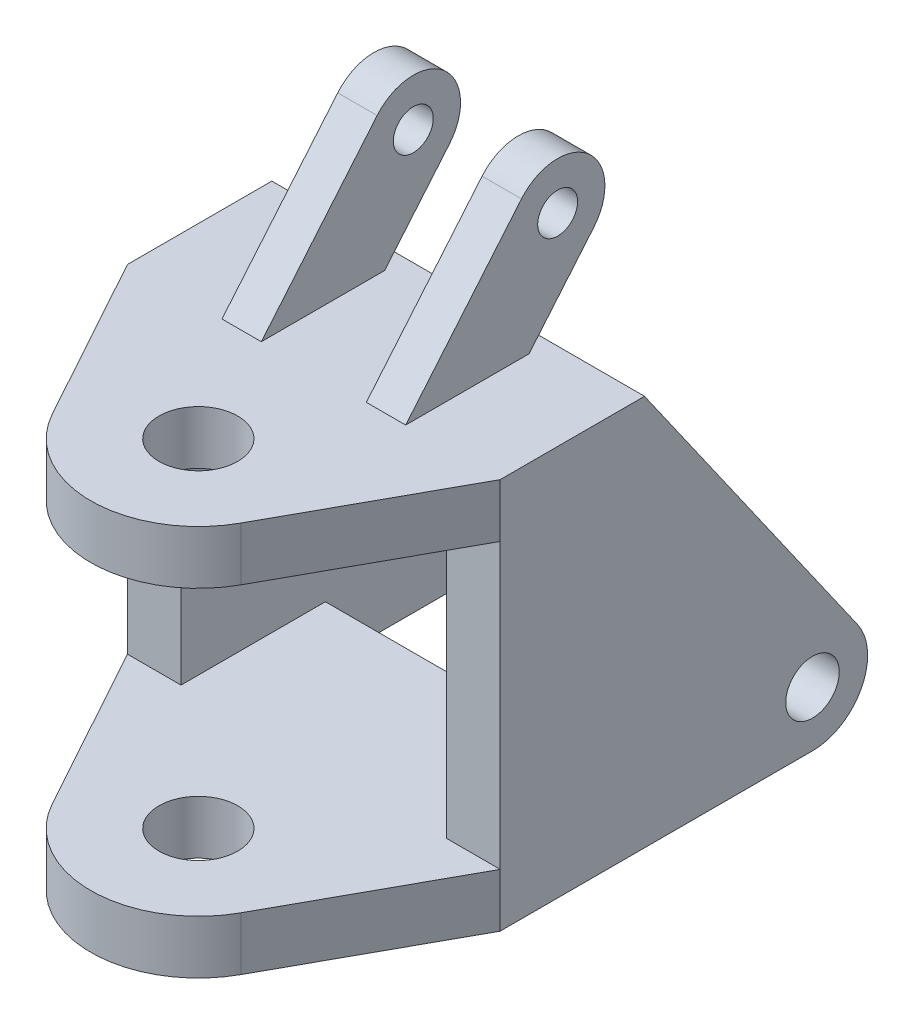
ISO-10303-21;
HEADER;
FILE_DESCRIPTION(('STEP AP214'),'2;1');
FILE_NAME('part.step','',(''),(''),'','','');
FILE_SCHEMA(('AUTOMOTIVE_DESIGN { 1 0 10303 214 1 1 1 1 }'));
ENDSEC;
DATA;
#1=APPLICATION_CONTEXT('core data for automotive mechanical design processes');
#2=APPLICATION_PROTOCOL_DEFINITION('international standard','automotive_design',2000,#1);
#3=PRODUCT_CONTEXT('',#1,'mechanical');
#4=PRODUCT('Part','Part','',(#3));
#5=PRODUCT_RELATED_PRODUCT_CATEGORY('part','',(#4));
#6=PRODUCT_DEFINITION_FORMATION('','',#4);
#7=PRODUCT_DEFINITION_CONTEXT('part definition',#1,'design');
#8=PRODUCT_DEFINITION('design','',#6,#7);
#9=PRODUCT_DEFINITION_SHAPE('','',#8);
#10=(LENGTH_UNIT() NAMED_UNIT(*) SI_UNIT(.MILLI.,.METRE.));
#11=(NAMED_UNIT(*) PLANE_ANGLE_UNIT() SI_UNIT($,.RADIAN.));
#12=(NAMED_UNIT(*) SI_UNIT($,.STERADIAN.) SOLID_ANGLE_UNIT());
#13=UNCERTAINTY_MEASURE_WITH_UNIT(LENGTH_MEASURE(1.E-05),#10,'distance_accuracy_value','');
#14=(GEOMETRIC_REPRESENTATION_CONTEXT(3) GLOBAL_UNCERTAINTY_ASSIGNED_CONTEXT((#13)) GLOBAL_UNIT_ASSIGNED_CONTEXT((#10,
#11,#12)) REPRESENTATION_CONTEXT('',''));
#15=CARTESIAN_POINT('',(0.,0.,0.));
#16=DIRECTION('',(0.,0.,1.));
#17=DIRECTION('',(1.,0.,0.));
#18=AXIS2_PLACEMENT_3D('',#15,#16,#17);
#19=CARTESIAN_POINT('',(253.,745.,-220.));
#20=DIRECTION('',(0.,1.,0.));
#21=DIRECTION('',(0.,0.,1.));
#22=AXIS2_PLACEMENT_3D('',#19,#20,#21);
#23=PLANE('',#22);
#24=DIRECTION('',(0.,0.,-1.));
#25=VECTOR('',#24,1.);
#26=CARTESIAN_POINT('',(-175.,745.,-220.));
#27=LINE('',#26,#25);
#28=CARTESIAN_POINT('',(-175.,745.,-220.));
#29=VERTEX_POINT('',#28);
#30=CARTESIAN_POINT('',(-175.,745.,-454.973312079811));
#31=VERTEX_POINT('',#30);
#32=EDGE_CURVE('E249',#29,#31,#27,.T.);
#33=ORIENTED_EDGE('',*,*,#32,.T.);
#34=DIRECTION('',(1.,0.,0.));
#35=VECTOR('',#34,1.);
#36=CARTESIAN_POINT('',(-175.,745.,-454.973312079811));
#37=LINE('',#36,#35);
#38=CARTESIAN_POINT('',(-100.,745.,-454.973312079811));
#39=VERTEX_POINT('',#38);
#40=EDGE_CURVE('E235',#31,#39,#37,.T.);
#41=ORIENTED_EDGE('',*,*,#40,.T.);
#42=DIRECTION('',(0.,0.,-1.));
#43=VECTOR('',#42,1.);
#44=CARTESIAN_POINT('',(-100.,745.,-220.));
#45=LINE('',#44,#43);
#46=CARTESIAN_POINT('',(-100.,745.,-220.));
#47=VERTEX_POINT('',#46);
#48=EDGE_CURVE('E264',#47,#39,#45,.T.);
#49=ORIENTED_EDGE('',*,*,#48,.F.);
#50=DIRECTION('',(1.,0.,0.));
#51=VECTOR('',#50,1.);
#52=CARTESIAN_POINT('',(-175.,745.,-220.));
#53=LINE('',#52,#51);
#54=EDGE_CURVE('E271',#29,#47,#53,.T.);
#55=ORIENTED_EDGE('',*,*,#54,.F.);
#56=EDGE_LOOP('',(#33,#41,#49,#55));
#57=FACE_BOUND('',#56,.T.);
#58=DIRECTION('',(0.48200188235911,0.,-0.876170180616913));
#59=VECTOR('',#58,1.);
#60=CARTESIAN_POINT('',(355.,745.,-220.));
#61=LINE('',#60,#59);
#62=CARTESIAN_POINT('',(179.614887026467,745.,98.8103858836175));
#63=VERTEX_POINT('',#62);
#64=CARTESIAN_POINT('',(355.,745.,-220.));
#65=VERTEX_POINT('',#64);
#66=EDGE_CURVE('E338',#63,#65,#61,.T.);
#67=ORIENTED_EDGE('',*,*,#66,.T.);
#68=DIRECTION('',(0.,0.,1.));
#69=VECTOR('',#68,1.);
#70=CARTESIAN_POINT('',(355.,745.,-220.));
#71=LINE('',#70,#69);
#72=CARTESIAN_POINT('',(355.,745.,-495.));
#73=VERTEX_POINT('',#72);
#74=EDGE_CURVE('E477',#73,#65,#71,.T.);
#75=ORIENTED_EDGE('',*,*,#74,.F.);
#76=DIRECTION('',(1.,0.,0.));
#77=VECTOR('',#76,1.);
#78=CARTESIAN_POINT('',(253.,745.,-495.));
#79=LINE('',#78,#77);
#80=CARTESIAN_POINT('',(253.,745.,-495.));
#81=VERTEX_POINT('',#80);
#82=EDGE_CURVE('E485',#81,#73,#79,.T.);
#83=ORIENTED_EDGE('',*,*,#82,.F.);
#84=DIRECTION('',(-1.,0.,0.));
#85=VECTOR('',#84,1.);
#86=CARTESIAN_POINT('',(-355.,745.,-495.));
#87=LINE('',#86,#85);
#88=CARTESIAN_POINT('',(-253.,745.,-495.));
#89=VERTEX_POINT('',#88);
#90=EDGE_CURVE('E358',#81,#89,#87,.T.);
#91=ORIENTED_EDGE('',*,*,#90,.T.);
#92=DIRECTION('',(-1.,0.,0.));
#93=VECTOR('',#92,1.);
#94=CARTESIAN_POINT('',(-253.,745.,-495.));
#95=LINE('',#94,#93);
#96=CARTESIAN_POINT('',(-355.,745.,-495.));
#97=VERTEX_POINT('',#96);
#98=EDGE_CURVE('E409',#89,#97,#95,.T.);
#99=ORIENTED_EDGE('',*,*,#98,.T.);
#100=DIRECTION('',(0.,0.,1.));
#101=VECTOR('',#100,1.);
#102=CARTESIAN_POINT('',(-355.,745.,-220.));
#103=LINE('',#102,#101);
#104=CARTESIAN_POINT('',(-355.,745.,-220.));
#105=VERTEX_POINT('',#104);
#106=EDGE_CURVE('E414',#97,#105,#103,.T.);
#107=ORIENTED_EDGE('',*,*,#106,.T.);
#108=DIRECTION('',(0.48200188235911,0.,0.876170180616913));
#109=VECTOR('',#108,1.);
#110=CARTESIAN_POINT('',(-179.614887026467,745.,98.8103858836175));
#111=LINE('',#110,#109);
#112=CARTESIAN_POINT('',(-179.614887026467,745.,98.8103858836175));
#113=VERTEX_POINT('',#112);
#114=EDGE_CURVE('E354',#105,#113,#111,.T.);
#115=ORIENTED_EDGE('',*,*,#114,.T.);
#116=CARTESIAN_POINT('',(0.,745.,0.));
#117=DIRECTION('',(0.,1.,0.));
#118=DIRECTION('',(0.,0.,1.));
#119=AXIS2_PLACEMENT_3D('',#116,#117,#118);
#120=CIRCLE('',#119,205.);
#121=EDGE_CURVE('E329',#113,#63,#120,.T.);
#122=ORIENTED_EDGE('',*,*,#121,.T.);
#123=EDGE_LOOP('',(#67,#75,#83,#91,#99,#107,#115,#122));
#124=FACE_BOUND('',#123,.T.);
#125=CARTESIAN_POINT('',(0.,745.,0.));
#126=DIRECTION('',(0.,1.,0.));
#127=DIRECTION('',(0.,0.,1.));
#128=AXIS2_PLACEMENT_3D('',#125,#126,#127);
#129=CIRCLE('',#128,75.);
#130=CARTESIAN_POINT('',(0.,745.,75.));
#131=VERTEX_POINT('',#130);
#132=EDGE_CURVE('E324',#131,#131,#129,.T.);
#133=ORIENTED_EDGE('',*,*,#132,.F.);
#134=EDGE_LOOP('',(#133));
#135=FACE_BOUND('',#134,.T.);
#136=DIRECTION('',(0.,0.,-1.));
#137=VECTOR('',#136,1.);
#138=CARTESIAN_POINT('',(175.,745.,-220.));
#139=LINE('',#138,#137);
#140=CARTESIAN_POINT('',(175.,745.,-220.));
#141=VERTEX_POINT('',#140);
#142=CARTESIAN_POINT('',(175.,745.,-454.973312079811));
#143=VERTEX_POINT('',#142);
#144=EDGE_CURVE('E292',#141,#143,#139,.T.);
#145=ORIENTED_EDGE('',*,*,#144,.F.);
#146=DIRECTION('',(-1.,0.,0.));
#147=VECTOR('',#146,1.);
#148=CARTESIAN_POINT('',(175.,745.,-220.));
#149=LINE('',#148,#147);
#150=CARTESIAN_POINT('',(100.,745.,-220.));
#151=VERTEX_POINT('',#150);
#152=EDGE_CURVE('E316',#141,#151,#149,.T.);
#153=ORIENTED_EDGE('',*,*,#152,.T.);
#154=DIRECTION('',(0.,0.,-1.));
#155=VECTOR('',#154,1.);
#156=CARTESIAN_POINT('',(100.,745.,-220.));
#157=LINE('',#156,#155);
#158=CARTESIAN_POINT('',(100.,745.,-454.973312079811));
#159=VERTEX_POINT('',#158);
#160=EDGE_CURVE('E304',#151,#159,#157,.T.);
#161=ORIENTED_EDGE('',*,*,#160,.T.);
#162=DIRECTION('',(-1.,0.,0.));
#163=VECTOR('',#162,1.);
#164=CARTESIAN_POINT('',(175.,745.,-454.973312079811));
#165=LINE('',#164,#163);
#166=EDGE_CURVE('E313',#143,#159,#165,.T.);
#167=ORIENTED_EDGE('',*,*,#166,.F.);
#168=EDGE_LOOP('',(#145,#153,#161,#167));
#169=FACE_BOUND('',#168,.T.);
#170=ADVANCED_FACE('F43',(#57,#124,#135,#169),#23,.T.);
#171=CARTESIAN_POINT('',(-355.,102.,-495.));
#172=DIRECTION('',(0.,0.,1.));
#173=DIRECTION('',(1.,0.,0.));
#174=AXIS2_PLACEMENT_3D('',#171,#172,#173);
#175=PLANE('',#174);
#176=DIRECTION('',(0.,-1.,0.));
#177=VECTOR('',#176,1.);
#178=CARTESIAN_POINT('',(-253.,102.,-495.));
#179=LINE('',#178,#177);
#180=CARTESIAN_POINT('',(-253.,102.,-495.));
#181=VERTEX_POINT('',#180);
#182=CARTESIAN_POINT('',(-253.,0.,-495.));
#183=VERTEX_POINT('',#182);
#184=EDGE_CURVE('E442',#181,#183,#179,.T.);
#185=ORIENTED_EDGE('',*,*,#184,.F.);
#186=DIRECTION('',(-1.,0.,0.));
#187=VECTOR('',#186,1.);
#188=CARTESIAN_POINT('',(-355.,102.,-495.));
#189=LINE('',#188,#187);
#190=CARTESIAN_POINT('',(253.,102.,-495.));
#191=VERTEX_POINT('',#190);
#192=EDGE_CURVE('E519',#191,#181,#189,.T.);
#193=ORIENTED_EDGE('',*,*,#192,.F.);
#194=DIRECTION('',(0.,1.,0.));
#195=VECTOR('',#194,1.);
#196=CARTESIAN_POINT('',(253.,102.,-495.));
#197=LINE('',#196,#195);
#198=CARTESIAN_POINT('',(253.,0.,-495.));
#199=VERTEX_POINT('',#198);
#200=EDGE_CURVE('E52',#199,#191,#197,.T.);
#201=ORIENTED_EDGE('',*,*,#200,.F.);
#202=DIRECTION('',(-1.,0.,0.));
#203=VECTOR('',#202,1.);
#204=CARTESIAN_POINT('',(-355.,0.,-495.));
#205=LINE('',#204,#203);
#206=EDGE_CURVE('E536',#199,#183,#205,.T.);
#207=ORIENTED_EDGE('',*,*,#206,.T.);
#208=EDGE_LOOP('',(#185,#193,#201,#207));
#209=FACE_BOUND('',#208,.T.);
#210=ADVANCED_FACE('F572',(#209),#175,.F.);
#211=CARTESIAN_POINT('',(0.,102.,0.));
#212=DIRECTION('',(0.,1.,0.));
#213=DIRECTION('',(0.,0.,1.));
#214=AXIS2_PLACEMENT_3D('',#211,#212,#213);
#215=PLANE('',#214);
#216=CARTESIAN_POINT('',(0.,102.,0.));
#217=DIRECTION('',(0.,1.,0.));
#218=DIRECTION('',(0.,0.,1.));
#219=AXIS2_PLACEMENT_3D('',#216,#217,#218);
#220=CIRCLE('',#219,75.);
#221=CARTESIAN_POINT('',(0.,102.,75.));
#222=VERTEX_POINT('',#221);
#223=EDGE_CURVE('E502',#222,#222,#220,.T.);
#224=ORIENTED_EDGE('',*,*,#223,.F.);
#225=EDGE_LOOP('',(#224));
#226=FACE_BOUND('',#225,.T.);
#227=ORIENTED_EDGE('',*,*,#192,.T.);
#228=DIRECTION('',(0.,0.,1.));
#229=VECTOR('',#228,1.);
#230=CARTESIAN_POINT('',(-253.,102.,0.));
#231=LINE('',#230,#229);
#232=CARTESIAN_POINT('',(-253.,102.,-220.));
#233=VERTEX_POINT('',#232);
#234=EDGE_CURVE('E438',#181,#233,#231,.T.);
#235=ORIENTED_EDGE('',*,*,#234,.T.);
#236=DIRECTION('',(-1.,0.,0.));
#237=VECTOR('',#236,1.);
#238=CARTESIAN_POINT('',(0.,102.,-220.));
#239=LINE('',#238,#237);
#240=CARTESIAN_POINT('',(-355.,102.,-220.));
#241=VERTEX_POINT('',#240);
#242=EDGE_CURVE('E427',#233,#241,#239,.T.);
#243=ORIENTED_EDGE('',*,*,#242,.T.);
#244=DIRECTION('',(0.48200188235911,0.,0.876170180616913));
#245=VECTOR('',#244,1.);
#246=CARTESIAN_POINT('',(-179.614887026467,102.,98.8103858836175));
#247=LINE('',#246,#245);
#248=CARTESIAN_POINT('',(-179.614887026467,102.,98.8103858836175));
#249=VERTEX_POINT('',#248);
#250=EDGE_CURVE('E523',#241,#249,#247,.T.);
#251=ORIENTED_EDGE('',*,*,#250,.T.);
#252=CARTESIAN_POINT('',(0.,102.,0.));
#253=DIRECTION('',(0.,1.,0.));
#254=DIRECTION('',(0.,0.,1.));
#255=AXIS2_PLACEMENT_3D('',#252,#253,#254);
#256=CIRCLE('',#255,205.);
#257=CARTESIAN_POINT('',(179.614887026467,102.,98.8103858836175));
#258=VERTEX_POINT('',#257);
#259=EDGE_CURVE('E510',#249,#258,#256,.T.);
#260=ORIENTED_EDGE('',*,*,#259,.T.);
#261=DIRECTION('',(0.48200188235911,0.,-0.876170180616913));
#262=VECTOR('',#261,1.);
#263=CARTESIAN_POINT('',(355.,102.,-220.));
#264=LINE('',#263,#262);
#265=CARTESIAN_POINT('',(355.,102.,-220.));
#266=VERTEX_POINT('',#265);
#267=EDGE_CURVE('E514',#258,#266,#264,.T.);
#268=ORIENTED_EDGE('',*,*,#267,.T.);
#269=DIRECTION('',(1.,0.,0.));
#270=VECTOR('',#269,1.);
#271=CARTESIAN_POINT('',(0.,102.,-220.));
#272=LINE('',#271,#270);
#273=CARTESIAN_POINT('',(253.,102.,-220.));
#274=VERTEX_POINT('',#273);
#275=EDGE_CURVE('E497',#274,#266,#272,.T.);
#276=ORIENTED_EDGE('',*,*,#275,.F.);
#277=DIRECTION('',(0.,0.,-1.));
#278=VECTOR('',#277,1.);
#279=CARTESIAN_POINT('',(253.,102.,0.));
#280=LINE('',#279,#278);
#281=EDGE_CURVE('E488',#274,#191,#280,.T.);
#282=ORIENTED_EDGE('',*,*,#281,.T.);
#283=EDGE_LOOP('',(#227,#235,#243,#251,#260,#268,#276,#282));
#284=FACE_BOUND('',#283,.T.);
#285=ADVANCED_FACE('F626',(#226,#284),#215,.T.);
#286=CARTESIAN_POINT('',(0.,0.,0.));
#287=DIRECTION('',(0.,1.,0.));
#288=DIRECTION('',(0.,0.,1.));
#289=AXIS2_PLACEMENT_3D('',#286,#287,#288);
#290=PLANE('',#289);
#291=DIRECTION('',(0.,0.,1.));
#292=VECTOR('',#291,1.);
#293=CARTESIAN_POINT('',(-355.,0.,-220.));
#294=LINE('',#293,#292);
#295=CARTESIAN_POINT('',(-355.,0.,-815.));
#296=VERTEX_POINT('',#295);
#297=CARTESIAN_POINT('',(-355.,0.,-220.));
#298=VERTEX_POINT('',#297);
#299=EDGE_CURVE('E540',#296,#298,#294,.T.);
#300=ORIENTED_EDGE('',*,*,#299,.F.);
#301=DIRECTION('',(-1.,0.,0.));
#302=VECTOR('',#301,1.);
#303=CARTESIAN_POINT('',(-253.,0.,-815.));
#304=LINE('',#303,#302);
#305=CARTESIAN_POINT('',(-253.,0.,-815.));
#306=VERTEX_POINT('',#305);
#307=EDGE_CURVE('E423',#306,#296,#304,.T.);
#308=ORIENTED_EDGE('',*,*,#307,.F.);
#309=DIRECTION('',(0.,0.,-1.));
#310=VECTOR('',#309,1.);
#311=CARTESIAN_POINT('',(-253.,0.,-815.));
#312=LINE('',#311,#310);
#313=EDGE_CURVE('E396',#183,#306,#312,.T.);
#314=ORIENTED_EDGE('',*,*,#313,.F.);
#315=ORIENTED_EDGE('',*,*,#206,.F.);
#316=DIRECTION('',(0.,0.,-1.));
#317=VECTOR('',#316,1.);
#318=CARTESIAN_POINT('',(253.,0.,-815.));
#319=LINE('',#318,#317);
#320=CARTESIAN_POINT('',(253.,0.,-815.));
#321=VERTEX_POINT('',#320);
#322=EDGE_CURVE('E454',#199,#321,#319,.T.);
#323=ORIENTED_EDGE('',*,*,#322,.T.);
#324=DIRECTION('',(1.,0.,0.));
#325=VECTOR('',#324,1.);
#326=CARTESIAN_POINT('',(253.,0.,-815.));
#327=LINE('',#326,#325);
#328=CARTESIAN_POINT('',(355.,0.,-815.));
#329=VERTEX_POINT('',#328);
#330=EDGE_CURVE('E469',#321,#329,#327,.T.);
#331=ORIENTED_EDGE('',*,*,#330,.T.);
#332=DIRECTION('',(0.,0.,-1.));
#333=VECTOR('',#332,1.);
#334=CARTESIAN_POINT('',(355.,0.,-495.));
#335=LINE('',#334,#333);
#336=CARTESIAN_POINT('',(355.,0.,-220.));
#337=VERTEX_POINT('',#336);
#338=EDGE_CURVE('E533',#337,#329,#335,.T.);
#339=ORIENTED_EDGE('',*,*,#338,.F.);
#340=DIRECTION('',(0.48200188235911,0.,-0.876170180616913));
#341=VECTOR('',#340,1.);
#342=CARTESIAN_POINT('',(355.,0.,-220.));
#343=LINE('',#342,#341);
#344=CARTESIAN_POINT('',(179.614887026467,0.,98.8103858836175));
#345=VERTEX_POINT('',#344);
#346=EDGE_CURVE('E530',#345,#337,#343,.T.);
#347=ORIENTED_EDGE('',*,*,#346,.F.);
#348=CARTESIAN_POINT('',(0.,0.,0.));
#349=DIRECTION('',(0.,1.,0.));
#350=DIRECTION('',(0.,0.,1.));
#351=AXIS2_PLACEMENT_3D('',#348,#349,#350);
#352=CIRCLE('',#351,205.);
#353=CARTESIAN_POINT('',(-179.614887026467,0.,98.8103858836175));
#354=VERTEX_POINT('',#353);
#355=EDGE_CURVE('E506',#354,#345,#352,.T.);
#356=ORIENTED_EDGE('',*,*,#355,.F.);
#357=DIRECTION('',(0.48200188235911,0.,0.876170180616913));
#358=VECTOR('',#357,1.);
#359=CARTESIAN_POINT('',(-179.614887026467,0.,98.8103858836175));
#360=LINE('',#359,#358);
#361=EDGE_CURVE('E515',#298,#354,#360,.T.);
#362=ORIENTED_EDGE('',*,*,#361,.F.);
#363=EDGE_LOOP('',(#300,#308,#314,#315,#323,#331,#339,#347,#356,#362));
#364=FACE_BOUND('',#363,.T.);
#365=CARTESIAN_POINT('',(0.,0.,0.));
#366=DIRECTION('',(0.,1.,0.));
#367=DIRECTION('',(0.,0.,1.));
#368=AXIS2_PLACEMENT_3D('',#365,#366,#367);
#369=CIRCLE('',#368,75.);
#370=CARTESIAN_POINT('',(0.,0.,75.));
#371=VERTEX_POINT('',#370);
#372=EDGE_CURVE('E501',#371,#371,#369,.T.);
#373=ORIENTED_EDGE('',*,*,#372,.T.);
#374=EDGE_LOOP('',(#373));
#375=FACE_BOUND('',#374,.T.);
#376=ADVANCED_FACE('F575',(#364,#375),#290,.F.);
#377=CARTESIAN_POINT('',(0.,102.,0.));
#378=DIRECTION('',(0.,-1.,0.));
#379=DIRECTION('',(0.,0.,-1.));
#380=AXIS2_PLACEMENT_3D('',#377,#378,#379);
#381=CYLINDRICAL_SURFACE('',#380,205.);
#382=ORIENTED_EDGE('',*,*,#355,.T.);
#383=DIRECTION('',(0.,-1.,0.));
#384=VECTOR('',#383,1.);
#385=CARTESIAN_POINT('',(179.614887026467,102.,98.8103858836175));
#386=LINE('',#385,#384);
#387=EDGE_CURVE('E556',#258,#345,#386,.T.);
#388=ORIENTED_EDGE('',*,*,#387,.F.);
#389=ORIENTED_EDGE('',*,*,#259,.F.);
#390=DIRECTION('',(0.,-1.,0.));
#391=VECTOR('',#390,1.);
#392=CARTESIAN_POINT('',(-179.614887026467,102.,98.8103858836175));
#393=LINE('',#392,#391);
#394=EDGE_CURVE('E526',#249,#354,#393,.T.);
#395=ORIENTED_EDGE('',*,*,#394,.T.);
#396=EDGE_LOOP('',(#382,#388,#389,#395));
#397=FACE_BOUND('',#396,.T.);
#398=ADVANCED_FACE('F45',(#397),#381,.T.);
#399=CARTESIAN_POINT('',(355.,102.,-220.));
#400=DIRECTION('',(-0.876170180616913,0.,-0.48200188235911));
#401=DIRECTION('',(-0.48200188235911,0.,0.876170180616913));
#402=AXIS2_PLACEMENT_3D('',#399,#400,#401);
#403=PLANE('',#402);
#404=ORIENTED_EDGE('',*,*,#346,.T.);
#405=DIRECTION('',(0.,-1.,0.));
#406=VECTOR('',#405,1.);
#407=CARTESIAN_POINT('',(355.,102.,-220.));
#408=LINE('',#407,#406);
#409=EDGE_CURVE('E552',#266,#337,#408,.T.);
#410=ORIENTED_EDGE('',*,*,#409,.F.);
#411=ORIENTED_EDGE('',*,*,#267,.F.);
#412=ORIENTED_EDGE('',*,*,#387,.T.);
#413=EDGE_LOOP('',(#404,#410,#411,#412));
#414=FACE_BOUND('',#413,.T.);
#415=ADVANCED_FACE('F620',(#414),#403,.F.);
#416=CARTESIAN_POINT('',(355.,102.,-495.));
#417=DIRECTION('',(-1.,0.,0.));
#418=DIRECTION('',(0.,0.,1.));
#419=AXIS2_PLACEMENT_3D('',#416,#417,#418);
#420=PLANE('',#419);
#421=DIRECTION('',(0.,0.81911984316101,0.573622421580505));
#422=VECTOR('',#421,1.);
#423=CARTESIAN_POINT('',(355.,745.,-495.));
#424=LINE('',#423,#422);
#425=CARTESIAN_POINT('',(355.,165.230354265953,-901.007583531906));
#426=VERTEX_POINT('',#425);
#427=EDGE_CURVE('E473',#426,#73,#424,.T.);
#428=ORIENTED_EDGE('',*,*,#427,.T.);
#429=ORIENTED_EDGE('',*,*,#74,.T.);
#430=DIRECTION('',(0.,-1.,0.));
#431=VECTOR('',#430,1.);
#432=CARTESIAN_POINT('',(355.,0.,-220.));
#433=LINE('',#432,#431);
#434=CARTESIAN_POINT('',(355.,643.,-220.));
#435=VERTEX_POINT('',#434);
#436=EDGE_CURVE('E458',#65,#435,#433,.T.);
#437=ORIENTED_EDGE('',*,*,#436,.T.);
#438=EDGE_CURVE('E481',#435,#266,#433,.T.);
#439=ORIENTED_EDGE('',*,*,#438,.T.);
#440=ORIENTED_EDGE('',*,*,#409,.T.);
#441=ORIENTED_EDGE('',*,*,#338,.T.);
#442=CARTESIAN_POINT('',(355.,105.,-815.));
#443=DIRECTION('',(1.,0.,0.));
#444=DIRECTION('',(0.,0.,-1.));
#445=AXIS2_PLACEMENT_3D('',#442,#443,#444);
#446=CIRCLE('',#445,105.);
#447=EDGE_CURVE('E450',#329,#426,#446,.T.);
#448=ORIENTED_EDGE('',*,*,#447,.T.);
#449=EDGE_LOOP('',(#428,#429,#437,#439,#440,#441,#448));
#450=FACE_BOUND('',#449,.T.);
#451=CARTESIAN_POINT('',(355.,105.,-815.));
#452=DIRECTION('',(1.,0.,0.));
#453=DIRECTION('',(0.,0.,-1.));
#454=AXIS2_PLACEMENT_3D('',#451,#452,#453);
#455=CIRCLE('',#454,51.0000000000001);
#456=CARTESIAN_POINT('',(355.,105.,-866.));
#457=VERTEX_POINT('',#456);
#458=EDGE_CURVE('E445',#457,#457,#455,.T.);
#459=ORIENTED_EDGE('',*,*,#458,.F.);
#460=EDGE_LOOP('',(#459));
#461=FACE_BOUND('',#460,.T.);
#462=ADVANCED_FACE('F615',(#450,#461),#420,.F.);
#463=CARTESIAN_POINT('',(-355.,102.,-220.));
#464=DIRECTION('',(1.,0.,0.));
#465=DIRECTION('',(0.,0.,-1.));
#466=AXIS2_PLACEMENT_3D('',#463,#464,#465);
#467=PLANE('',#466);
#468=ORIENTED_EDGE('',*,*,#106,.F.);
#469=DIRECTION('',(0.,0.81911984316101,0.573622421580505));
#470=VECTOR('',#469,1.);
#471=CARTESIAN_POINT('',(-355.,745.,-495.));
#472=LINE('',#471,#470);
#473=CARTESIAN_POINT('',(-355.,165.230354265953,-901.007583531906));
#474=VERTEX_POINT('',#473);
#475=EDGE_CURVE('E418',#474,#97,#472,.T.);
#476=ORIENTED_EDGE('',*,*,#475,.F.);
#477=CARTESIAN_POINT('',(-355.,105.,-815.));
#478=DIRECTION('',(1.,0.,0.));
#479=DIRECTION('',(0.,0.,-1.));
#480=AXIS2_PLACEMENT_3D('',#477,#478,#479);
#481=CIRCLE('',#480,105.);
#482=EDGE_CURVE('E400',#296,#474,#481,.T.);
#483=ORIENTED_EDGE('',*,*,#482,.F.);
#484=ORIENTED_EDGE('',*,*,#299,.T.);
#485=DIRECTION('',(0.,-1.,0.));
#486=VECTOR('',#485,1.);
#487=CARTESIAN_POINT('',(-355.,102.,-220.));
#488=LINE('',#487,#486);
#489=EDGE_CURVE('E548',#241,#298,#488,.T.);
#490=ORIENTED_EDGE('',*,*,#489,.F.);
#491=DIRECTION('',(0.,-1.,0.));
#492=VECTOR('',#491,1.);
#493=CARTESIAN_POINT('',(-355.,0.,-220.));
#494=LINE('',#493,#492);
#495=CARTESIAN_POINT('',(-355.,643.,-220.));
#496=VERTEX_POINT('',#495);
#497=EDGE_CURVE('E392',#496,#241,#494,.T.);
#498=ORIENTED_EDGE('',*,*,#497,.F.);
#499=EDGE_CURVE('E410',#105,#496,#494,.T.);
#500=ORIENTED_EDGE('',*,*,#499,.F.);
#501=EDGE_LOOP('',(#468,#476,#483,#484,#490,#498,#500));
#502=FACE_BOUND('',#501,.T.);
#503=CARTESIAN_POINT('',(-355.,105.,-815.));
#504=DIRECTION('',(1.,0.,0.));
#505=DIRECTION('',(0.,0.,-1.));
#506=AXIS2_PLACEMENT_3D('',#503,#504,#505);
#507=CIRCLE('',#506,51.0000000000001);
#508=CARTESIAN_POINT('',(-355.,105.,-866.));
#509=VERTEX_POINT('',#508);
#510=EDGE_CURVE('E387',#509,#509,#507,.T.);
#511=ORIENTED_EDGE('',*,*,#510,.T.);
#512=EDGE_LOOP('',(#511));
#513=FACE_BOUND('',#512,.T.);
#514=ADVANCED_FACE('F639',(#502,#513),#467,.F.);
#515=CARTESIAN_POINT('',(-179.614887026467,102.,98.8103858836175));
#516=DIRECTION('',(0.876170180616913,0.,-0.48200188235911));
#517=DIRECTION('',(-0.48200188235911,0.,-0.876170180616913));
#518=AXIS2_PLACEMENT_3D('',#515,#516,#517);
#519=PLANE('',#518);
#520=ORIENTED_EDGE('',*,*,#361,.T.);
#521=ORIENTED_EDGE('',*,*,#394,.F.);
#522=ORIENTED_EDGE('',*,*,#250,.F.);
#523=ORIENTED_EDGE('',*,*,#489,.T.);
#524=EDGE_LOOP('',(#520,#521,#522,#523));
#525=FACE_BOUND('',#524,.T.);
#526=ADVANCED_FACE('F634',(#525),#519,.F.);
#527=CARTESIAN_POINT('',(0.,102.,0.));
#528=DIRECTION('',(0.,-1.,0.));
#529=DIRECTION('',(0.,0.,-1.));
#530=AXIS2_PLACEMENT_3D('',#527,#528,#529);
#531=CYLINDRICAL_SURFACE('',#530,75.);
#532=ORIENTED_EDGE('',*,*,#223,.T.);
#533=EDGE_LOOP('',(#532));
#534=FACE_BOUND('',#533,.T.);
#535=ORIENTED_EDGE('',*,*,#372,.F.);
#536=EDGE_LOOP('',(#535));
#537=FACE_BOUND('',#536,.T.);
#538=ADVANCED_FACE('F679',(#534,#537),#531,.F.);
#539=CARTESIAN_POINT('',(253.,0.,-220.));
#540=DIRECTION('',(0.,0.,1.));
#541=DIRECTION('',(1.,0.,0.));
#542=AXIS2_PLACEMENT_3D('',#539,#540,#541);
#543=PLANE('',#542);
#544=DIRECTION('',(1.,0.,0.));
#545=VECTOR('',#544,1.);
#546=CARTESIAN_POINT('',(253.,643.,-220.));
#547=LINE('',#546,#545);
#548=CARTESIAN_POINT('',(253.,643.,-220.));
#549=VERTEX_POINT('',#548);
#550=EDGE_CURVE('E377',#549,#435,#547,.T.);
#551=ORIENTED_EDGE('',*,*,#550,.F.);
#552=DIRECTION('',(0.,-1.,0.));
#553=VECTOR('',#552,1.);
#554=CARTESIAN_POINT('',(253.,0.,-220.));
#555=LINE('',#554,#553);
#556=EDGE_CURVE('E466',#549,#274,#555,.T.);
#557=ORIENTED_EDGE('',*,*,#556,.T.);
#558=ORIENTED_EDGE('',*,*,#275,.T.);
#559=ORIENTED_EDGE('',*,*,#438,.F.);
#560=EDGE_LOOP('',(#551,#557,#558,#559));
#561=FACE_BOUND('',#560,.T.);
#562=ADVANCED_FACE('F624',(#561),#543,.T.);
#563=CARTESIAN_POINT('',(253.,745.,-495.));
#564=DIRECTION('',(0.,0.573622421580505,-0.81911984316101));
#565=DIRECTION('',(0.,0.81911984316101,0.573622421580505));
#566=AXIS2_PLACEMENT_3D('',#563,#564,#565);
#567=PLANE('',#566);
#568=ORIENTED_EDGE('',*,*,#427,.F.);
#569=DIRECTION('',(1.,0.,0.));
#570=VECTOR('',#569,1.);
#571=CARTESIAN_POINT('',(253.,165.230354265953,-901.007583531906));
#572=LINE('',#571,#570);
#573=CARTESIAN_POINT('',(253.,165.230354265953,-901.007583531906));
#574=VERTEX_POINT('',#573);
#575=EDGE_CURVE('E489',#574,#426,#572,.T.);
#576=ORIENTED_EDGE('',*,*,#575,.F.);
#577=DIRECTION('',(0.,0.81911984316101,0.573622421580505));
#578=VECTOR('',#577,1.);
#579=CARTESIAN_POINT('',(253.,745.,-495.));
#580=LINE('',#579,#578);
#581=EDGE_CURVE('E462',#574,#81,#580,.T.);
#582=ORIENTED_EDGE('',*,*,#581,.T.);
#583=ORIENTED_EDGE('',*,*,#82,.T.);
#584=EDGE_LOOP('',(#568,#576,#582,#583));
#585=FACE_BOUND('',#584,.T.);
#586=ADVANCED_FACE('F608',(#585),#567,.T.);
#587=CARTESIAN_POINT('',(253.,105.,-815.));
#588=DIRECTION('',(1.,0.,0.));
#589=DIRECTION('',(0.,0.,-1.));
#590=AXIS2_PLACEMENT_3D('',#587,#588,#589);
#591=CYLINDRICAL_SURFACE('',#590,105.);
#592=ORIENTED_EDGE('',*,*,#447,.F.);
#593=ORIENTED_EDGE('',*,*,#330,.F.);
#594=CARTESIAN_POINT('',(253.,105.,-815.));
#595=DIRECTION('',(1.,0.,0.));
#596=DIRECTION('',(0.,0.,-1.));
#597=AXIS2_PLACEMENT_3D('',#594,#595,#596);
#598=CIRCLE('',#597,105.);
#599=EDGE_CURVE('E457',#321,#574,#598,.T.);
#600=ORIENTED_EDGE('',*,*,#599,.T.);
#601=ORIENTED_EDGE('',*,*,#575,.T.);
#602=EDGE_LOOP('',(#592,#593,#600,#601));
#603=FACE_BOUND('',#602,.T.);
#604=ADVANCED_FACE('F611',(#603),#591,.T.);
#605=CARTESIAN_POINT('',(253.,105.,-815.));
#606=DIRECTION('',(1.,0.,0.));
#607=DIRECTION('',(0.,0.,-1.));
#608=AXIS2_PLACEMENT_3D('',#605,#606,#607);
#609=PLANE('',#608);
#610=DIRECTION('',(0.,0.,-1.));
#611=VECTOR('',#610,1.);
#612=CARTESIAN_POINT('',(253.,643.,-815.));
#613=LINE('',#612,#611);
#614=CARTESIAN_POINT('',(253.,643.,-495.));
#615=VERTEX_POINT('',#614);
#616=EDGE_CURVE('E373',#549,#615,#613,.T.);
#617=ORIENTED_EDGE('',*,*,#616,.T.);
#618=DIRECTION('',(0.,1.,0.));
#619=VECTOR('',#618,1.);
#620=CARTESIAN_POINT('',(253.,105.,-495.));
#621=LINE('',#620,#619);
#622=EDGE_CURVE('E383',#615,#81,#621,.T.);
#623=ORIENTED_EDGE('',*,*,#622,.T.);
#624=ORIENTED_EDGE('',*,*,#581,.F.);
#625=ORIENTED_EDGE('',*,*,#599,.F.);
#626=ORIENTED_EDGE('',*,*,#322,.F.);
#627=ORIENTED_EDGE('',*,*,#200,.T.);
#628=ORIENTED_EDGE('',*,*,#281,.F.);
#629=ORIENTED_EDGE('',*,*,#556,.F.);
#630=EDGE_LOOP('',(#617,#623,#624,#625,#626,#627,#628,#629));
#631=FACE_BOUND('',#630,.T.);
#632=CARTESIAN_POINT('',(253.,105.,-815.));
#633=DIRECTION('',(1.,0.,0.));
#634=DIRECTION('',(0.,0.,-1.));
#635=AXIS2_PLACEMENT_3D('',#632,#633,#634);
#636=CIRCLE('',#635,51.0000000000001);
#637=CARTESIAN_POINT('',(253.,105.,-866.));
#638=VERTEX_POINT('',#637);
#639=EDGE_CURVE('E446',#638,#638,#636,.T.);
#640=ORIENTED_EDGE('',*,*,#639,.T.);
#641=EDGE_LOOP('',(#640));
#642=FACE_BOUND('',#641,.T.);
#643=ADVANCED_FACE('F564',(#631,#642),#609,.F.);
#644=CARTESIAN_POINT('',(253.,105.,-815.));
#645=DIRECTION('',(1.,0.,0.));
#646=DIRECTION('',(0.,0.,-1.));
#647=AXIS2_PLACEMENT_3D('',#644,#645,#646);
#648=CYLINDRICAL_SURFACE('',#647,51.0000000000001);
#649=ORIENTED_EDGE('',*,*,#639,.F.);
#650=EDGE_LOOP('',(#649));
#651=FACE_BOUND('',#650,.T.);
#652=ORIENTED_EDGE('',*,*,#458,.T.);
#653=EDGE_LOOP('',(#652));
#654=FACE_BOUND('',#653,.T.);
#655=ADVANCED_FACE('F720',(#651,#654),#648,.F.);
#656=CARTESIAN_POINT('',(-253.,105.,-815.));
#657=DIRECTION('',(-1.,0.,0.));
#658=DIRECTION('',(0.,0.,-1.));
#659=AXIS2_PLACEMENT_3D('',#656,#657,#658);
#660=PLANE('',#659);
#661=CARTESIAN_POINT('',(-253.,105.,-815.));
#662=DIRECTION('',(1.,0.,0.));
#663=DIRECTION('',(0.,0.,-1.));
#664=AXIS2_PLACEMENT_3D('',#661,#662,#663);
#665=CIRCLE('',#664,51.0000000000001);
#666=CARTESIAN_POINT('',(-253.,105.,-866.));
#667=VERTEX_POINT('',#666);
#668=EDGE_CURVE('E388',#667,#667,#665,.T.);
#669=ORIENTED_EDGE('',*,*,#668,.F.);
#670=EDGE_LOOP('',(#669));
#671=FACE_BOUND('',#670,.T.);
#672=DIRECTION('',(0.,0.81911984316101,0.573622421580505));
#673=VECTOR('',#672,1.);
#674=CARTESIAN_POINT('',(-253.,745.,-495.));
#675=LINE('',#674,#673);
#676=CARTESIAN_POINT('',(-253.,165.230354265953,-901.007583531906));
#677=VERTEX_POINT('',#676);
#678=EDGE_CURVE('E403',#677,#89,#675,.T.);
#679=ORIENTED_EDGE('',*,*,#678,.T.);
#680=DIRECTION('',(0.,-1.,0.));
#681=VECTOR('',#680,1.);
#682=CARTESIAN_POINT('',(-253.,105.,-495.));
#683=LINE('',#682,#681);
#684=CARTESIAN_POINT('',(-253.,643.,-495.));
#685=VERTEX_POINT('',#684);
#686=EDGE_CURVE('E380',#89,#685,#683,.T.);
#687=ORIENTED_EDGE('',*,*,#686,.T.);
#688=DIRECTION('',(0.,0.,1.));
#689=VECTOR('',#688,1.);
#690=CARTESIAN_POINT('',(-253.,643.,-815.));
#691=LINE('',#690,#689);
#692=CARTESIAN_POINT('',(-253.,643.,-220.));
#693=VERTEX_POINT('',#692);
#694=EDGE_CURVE('E370',#685,#693,#691,.T.);
#695=ORIENTED_EDGE('',*,*,#694,.T.);
#696=DIRECTION('',(0.,-1.,0.));
#697=VECTOR('',#696,1.);
#698=CARTESIAN_POINT('',(-253.,0.,-220.));
#699=LINE('',#698,#697);
#700=EDGE_CURVE('E399',#693,#233,#699,.T.);
#701=ORIENTED_EDGE('',*,*,#700,.T.);
#702=ORIENTED_EDGE('',*,*,#234,.F.);
#703=ORIENTED_EDGE('',*,*,#184,.T.);
#704=ORIENTED_EDGE('',*,*,#313,.T.);
#705=CARTESIAN_POINT('',(-253.,105.,-815.));
#706=DIRECTION('',(1.,0.,0.));
#707=DIRECTION('',(0.,0.,-1.));
#708=AXIS2_PLACEMENT_3D('',#705,#706,#707);
#709=CIRCLE('',#708,105.);
#710=EDGE_CURVE('E406',#306,#677,#709,.T.);
#711=ORIENTED_EDGE('',*,*,#710,.T.);
#712=EDGE_LOOP('',(#679,#687,#695,#701,#702,#703,#704,#711));
#713=FACE_BOUND('',#712,.T.);
#714=ADVANCED_FACE('F581',(#671,#713),#660,.F.);
#715=CARTESIAN_POINT('',(-253.,105.,-815.));
#716=DIRECTION('',(-1.,0.,0.));
#717=DIRECTION('',(0.,0.,1.));
#718=AXIS2_PLACEMENT_3D('',#715,#716,#717);
#719=CYLINDRICAL_SURFACE('',#718,105.);
#720=ORIENTED_EDGE('',*,*,#482,.T.);
#721=DIRECTION('',(-1.,0.,0.));
#722=VECTOR('',#721,1.);
#723=CARTESIAN_POINT('',(-253.,165.230354265953,-901.007583531906));
#724=LINE('',#723,#722);
#725=EDGE_CURVE('E428',#677,#474,#724,.T.);
#726=ORIENTED_EDGE('',*,*,#725,.F.);
#727=ORIENTED_EDGE('',*,*,#710,.F.);
#728=ORIENTED_EDGE('',*,*,#307,.T.);
#729=EDGE_LOOP('',(#720,#726,#727,#728));
#730=FACE_BOUND('',#729,.T.);
#731=ADVANCED_FACE('F584',(#730),#719,.T.);
#732=CARTESIAN_POINT('',(-253.,745.,-495.));
#733=DIRECTION('',(0.,-0.573622421580505,0.81911984316101));
#734=DIRECTION('',(0.,-0.81911984316101,-0.573622421580505));
#735=AXIS2_PLACEMENT_3D('',#732,#733,#734);
#736=PLANE('',#735);
#737=ORIENTED_EDGE('',*,*,#475,.T.);
#738=ORIENTED_EDGE('',*,*,#98,.F.);
#739=ORIENTED_EDGE('',*,*,#678,.F.);
#740=ORIENTED_EDGE('',*,*,#725,.T.);
#741=EDGE_LOOP('',(#737,#738,#739,#740));
#742=FACE_BOUND('',#741,.T.);
#743=ADVANCED_FACE('F590',(#742),#736,.F.);
#744=CARTESIAN_POINT('',(-253.,0.,-220.));
#745=DIRECTION('',(0.,0.,-1.));
#746=DIRECTION('',(-1.,0.,0.));
#747=AXIS2_PLACEMENT_3D('',#744,#745,#746);
#748=PLANE('',#747);
#749=ORIENTED_EDGE('',*,*,#700,.F.);
#750=DIRECTION('',(-1.,0.,0.));
#751=VECTOR('',#750,1.);
#752=CARTESIAN_POINT('',(-253.,643.,-220.));
#753=LINE('',#752,#751);
#754=EDGE_CURVE('E11',#693,#496,#753,.T.);
#755=ORIENTED_EDGE('',*,*,#754,.T.);
#756=ORIENTED_EDGE('',*,*,#497,.T.);
#757=ORIENTED_EDGE('',*,*,#242,.F.);
#758=EDGE_LOOP('',(#749,#755,#756,#757));
#759=FACE_BOUND('',#758,.T.);
#760=ADVANCED_FACE('F791',(#759),#748,.F.);
#761=CARTESIAN_POINT('',(-253.,105.,-815.));
#762=DIRECTION('',(-1.,0.,0.));
#763=DIRECTION('',(0.,0.,1.));
#764=AXIS2_PLACEMENT_3D('',#761,#762,#763);
#765=CYLINDRICAL_SURFACE('',#764,51.0000000000001);
#766=ORIENTED_EDGE('',*,*,#668,.T.);
#767=EDGE_LOOP('',(#766));
#768=FACE_BOUND('',#767,.T.);
#769=ORIENTED_EDGE('',*,*,#510,.F.);
#770=EDGE_LOOP('',(#769));
#771=FACE_BOUND('',#770,.T.);
#772=ADVANCED_FACE('F801',(#768,#771),#765,.F.);
#773=CARTESIAN_POINT('',(-355.,643.,-495.));
#774=DIRECTION('',(0.,0.,-1.));
#775=DIRECTION('',(-1.,0.,0.));
#776=AXIS2_PLACEMENT_3D('',#773,#774,#775);
#777=PLANE('',#776);
#778=ORIENTED_EDGE('',*,*,#622,.F.);
#779=DIRECTION('',(-1.,0.,0.));
#780=VECTOR('',#779,1.);
#781=CARTESIAN_POINT('',(-355.,643.,-495.));
#782=LINE('',#781,#780);
#783=EDGE_CURVE('E342',#615,#685,#782,.T.);
#784=ORIENTED_EDGE('',*,*,#783,.T.);
#785=ORIENTED_EDGE('',*,*,#686,.F.);
#786=ORIENTED_EDGE('',*,*,#90,.F.);
#787=EDGE_LOOP('',(#778,#784,#785,#786));
#788=FACE_BOUND('',#787,.T.);
#789=ADVANCED_FACE('F600',(#788),#777,.T.);
#790=CARTESIAN_POINT('',(0.,643.,0.));
#791=DIRECTION('',(0.,-1.,0.));
#792=DIRECTION('',(0.,0.,1.));
#793=AXIS2_PLACEMENT_3D('',#790,#791,#792);
#794=PLANE('',#793);
#795=CARTESIAN_POINT('',(0.,643.,0.));
#796=DIRECTION('',(0.,1.,0.));
#797=DIRECTION('',(0.,0.,1.));
#798=AXIS2_PLACEMENT_3D('',#795,#796,#797);
#799=CIRCLE('',#798,75.);
#800=CARTESIAN_POINT('',(0.,643.,75.));
#801=VERTEX_POINT('',#800);
#802=EDGE_CURVE('E325',#801,#801,#799,.T.);
#803=ORIENTED_EDGE('',*,*,#802,.T.);
#804=EDGE_LOOP('',(#803));
#805=FACE_BOUND('',#804,.T.);
#806=ORIENTED_EDGE('',*,*,#616,.F.);
#807=ORIENTED_EDGE('',*,*,#550,.T.);
#808=DIRECTION('',(0.48200188235911,0.,-0.876170180616913));
#809=VECTOR('',#808,1.);
#810=CARTESIAN_POINT('',(355.,643.,-220.));
#811=LINE('',#810,#809);
#812=CARTESIAN_POINT('',(179.614887026467,643.,98.8103858836175));
#813=VERTEX_POINT('',#812);
#814=EDGE_CURVE('E346',#813,#435,#811,.T.);
#815=ORIENTED_EDGE('',*,*,#814,.F.);
#816=CARTESIAN_POINT('',(0.,643.,0.));
#817=DIRECTION('',(0.,1.,0.));
#818=DIRECTION('',(0.,0.,1.));
#819=AXIS2_PLACEMENT_3D('',#816,#817,#818);
#820=CIRCLE('',#819,205.);
#821=CARTESIAN_POINT('',(-179.614887026467,643.,98.8103858836175));
#822=VERTEX_POINT('',#821);
#823=EDGE_CURVE('E333',#822,#813,#820,.T.);
#824=ORIENTED_EDGE('',*,*,#823,.F.);
#825=DIRECTION('',(0.48200188235911,0.,0.876170180616913));
#826=VECTOR('',#825,1.);
#827=CARTESIAN_POINT('',(-179.614887026467,643.,98.8103858836175));
#828=LINE('',#827,#826);
#829=EDGE_CURVE('E337',#496,#822,#828,.T.);
#830=ORIENTED_EDGE('',*,*,#829,.F.);
#831=ORIENTED_EDGE('',*,*,#754,.F.);
#832=ORIENTED_EDGE('',*,*,#694,.F.);
#833=ORIENTED_EDGE('',*,*,#783,.F.);
#834=EDGE_LOOP('',(#806,#807,#815,#824,#830,#831,#832,#833));
#835=FACE_BOUND('',#834,.T.);
#836=ADVANCED_FACE('F598',(#805,#835),#794,.T.);
#837=CARTESIAN_POINT('',(0.,643.,0.));
#838=DIRECTION('',(0.,1.,0.));
#839=DIRECTION('',(0.,0.,1.));
#840=AXIS2_PLACEMENT_3D('',#837,#838,#839);
#841=CYLINDRICAL_SURFACE('',#840,205.);
#842=ORIENTED_EDGE('',*,*,#121,.F.);
#843=DIRECTION('',(0.,1.,0.));
#844=VECTOR('',#843,1.);
#845=CARTESIAN_POINT('',(-179.614887026467,643.,98.8103858836175));
#846=LINE('',#845,#844);
#847=EDGE_CURVE('E367',#822,#113,#846,.T.);
#848=ORIENTED_EDGE('',*,*,#847,.F.);
#849=ORIENTED_EDGE('',*,*,#823,.T.);
#850=DIRECTION('',(0.,1.,0.));
#851=VECTOR('',#850,1.);
#852=CARTESIAN_POINT('',(179.614887026467,643.,98.8103858836175));
#853=LINE('',#852,#851);
#854=EDGE_CURVE('E350',#813,#63,#853,.T.);
#855=ORIENTED_EDGE('',*,*,#854,.T.);
#856=EDGE_LOOP('',(#842,#848,#849,#855));
#857=FACE_BOUND('',#856,.T.);
#858=ADVANCED_FACE('F647',(#857),#841,.T.);
#859=CARTESIAN_POINT('',(-179.614887026467,643.,98.8103858836175));
#860=DIRECTION('',(-0.876170180616913,0.,0.48200188235911));
#861=DIRECTION('',(0.48200188235911,0.,0.876170180616913));
#862=AXIS2_PLACEMENT_3D('',#859,#860,#861);
#863=PLANE('',#862);
#864=ORIENTED_EDGE('',*,*,#114,.F.);
#865=ORIENTED_EDGE('',*,*,#499,.T.);
#866=ORIENTED_EDGE('',*,*,#829,.T.);
#867=ORIENTED_EDGE('',*,*,#847,.T.);
#868=EDGE_LOOP('',(#864,#865,#866,#867));
#869=FACE_BOUND('',#868,.T.);
#870=ADVANCED_FACE('F643',(#869),#863,.T.);
#871=CARTESIAN_POINT('',(355.,643.,-220.));
#872=DIRECTION('',(0.876170180616913,0.,0.48200188235911));
#873=DIRECTION('',(0.48200188235911,0.,-0.876170180616913));
#874=AXIS2_PLACEMENT_3D('',#871,#872,#873);
#875=PLANE('',#874);
#876=ORIENTED_EDGE('',*,*,#66,.F.);
#877=ORIENTED_EDGE('',*,*,#854,.F.);
#878=ORIENTED_EDGE('',*,*,#814,.T.);
#879=ORIENTED_EDGE('',*,*,#436,.F.);
#880=EDGE_LOOP('',(#876,#877,#878,#879));
#881=FACE_BOUND('',#880,.T.);
#882=ADVANCED_FACE('F650',(#881),#875,.T.);
#883=CARTESIAN_POINT('',(0.,643.,0.));
#884=DIRECTION('',(0.,1.,0.));
#885=DIRECTION('',(0.,0.,1.));
#886=AXIS2_PLACEMENT_3D('',#883,#884,#885);
#887=CYLINDRICAL_SURFACE('',#886,75.);
#888=ORIENTED_EDGE('',*,*,#802,.F.);
#889=EDGE_LOOP('',(#888));
#890=FACE_BOUND('',#889,.T.);
#891=ORIENTED_EDGE('',*,*,#132,.T.);
#892=EDGE_LOOP('',(#891));
#893=FACE_BOUND('',#892,.T.);
#894=ADVANCED_FACE('F653',(#890,#893),#887,.F.);
#895=CARTESIAN_POINT('',(175.,950.,-509.50208043125));
#896=DIRECTION('',(1.,0.,0.));
#897=DIRECTION('',(0.,0.,-1.));
#898=AXIS2_PLACEMENT_3D('',#895,#896,#897);
#899=PLANE('',#898);
#900=CARTESIAN_POINT('',(175.,950.,-509.50208043125));
#901=DIRECTION('',(1.,0.,0.));
#902=DIRECTION('',(0.,0.,-1.));
#903=AXIS2_PLACEMENT_3D('',#900,#901,#902);
#904=CIRCLE('',#903,90.);
#905=CARTESIAN_POINT('',(175.,892.149115128211,-578.446080311957));
#906=VERTEX_POINT('',#905);
#907=CARTESIAN_POINT('',(175.,1007.85088487179,-440.558080550542));
#908=VERTEX_POINT('',#907);
#909=EDGE_CURVE('E284',#906,#908,#904,.T.);
#910=ORIENTED_EDGE('',*,*,#909,.T.);
#911=DIRECTION('',(0.,-0.766044443118975,0.642787609686543));
#912=VECTOR('',#911,1.);
#913=CARTESIAN_POINT('',(175.,1007.85088487179,-440.558080550542));
#914=LINE('',#913,#912);
#915=EDGE_CURVE('E288',#908,#141,#914,.T.);
#916=ORIENTED_EDGE('',*,*,#915,.T.);
#917=ORIENTED_EDGE('',*,*,#144,.T.);
#918=DIRECTION('',(0.,0.766044443118975,-0.642787609686543));
#919=VECTOR('',#918,1.);
#920=CARTESIAN_POINT('',(175.,745.,-454.973312079811));
#921=LINE('',#920,#919);
#922=EDGE_CURVE('E67',#143,#906,#921,.T.);
#923=ORIENTED_EDGE('',*,*,#922,.T.);
#924=EDGE_LOOP('',(#910,#916,#917,#923));
#925=FACE_BOUND('',#924,.T.);
#926=CARTESIAN_POINT('',(175.,950.,-509.50208043125));
#927=DIRECTION('',(1.,0.,0.));
#928=DIRECTION('',(0.,0.,-1.));
#929=AXIS2_PLACEMENT_3D('',#926,#927,#928);
#930=CIRCLE('',#929,38.);
#931=CARTESIAN_POINT('',(175.,950.,-547.50208043125));
#932=VERTEX_POINT('',#931);
#933=EDGE_CURVE('E276',#932,#932,#930,.T.);
#934=ORIENTED_EDGE('',*,*,#933,.F.);
#935=EDGE_LOOP('',(#934));
#936=FACE_BOUND('',#935,.T.);
#937=ADVANCED_FACE('F659',(#925,#936),#899,.T.);
#938=CARTESIAN_POINT('',(100.,950.,-509.50208043125));
#939=DIRECTION('',(1.,0.,0.));
#940=DIRECTION('',(0.,0.,-1.));
#941=AXIS2_PLACEMENT_3D('',#938,#939,#940);
#942=PLANE('',#941);
#943=CARTESIAN_POINT('',(100.,950.,-509.50208043125));
#944=DIRECTION('',(1.,0.,0.));
#945=DIRECTION('',(0.,0.,-1.));
#946=AXIS2_PLACEMENT_3D('',#943,#944,#945);
#947=CIRCLE('',#946,90.);
#948=CARTESIAN_POINT('',(100.,892.149115128211,-578.446080311957));
#949=VERTEX_POINT('',#948);
#950=CARTESIAN_POINT('',(100.,1007.85088487179,-440.558080550542));
#951=VERTEX_POINT('',#950);
#952=EDGE_CURVE('E280',#949,#951,#947,.T.);
#953=ORIENTED_EDGE('',*,*,#952,.F.);
#954=DIRECTION('',(0.,0.766044443118975,-0.642787609686543));
#955=VECTOR('',#954,1.);
#956=CARTESIAN_POINT('',(100.,745.,-454.973312079811));
#957=LINE('',#956,#955);
#958=EDGE_CURVE('E289',#159,#949,#957,.T.);
#959=ORIENTED_EDGE('',*,*,#958,.F.);
#960=ORIENTED_EDGE('',*,*,#160,.F.);
#961=DIRECTION('',(0.,-0.766044443118975,0.642787609686543));
#962=VECTOR('',#961,1.);
#963=CARTESIAN_POINT('',(100.,1007.85088487179,-440.558080550542));
#964=LINE('',#963,#962);
#965=EDGE_CURVE('E301',#951,#151,#964,.T.);
#966=ORIENTED_EDGE('',*,*,#965,.F.);
#967=EDGE_LOOP('',(#953,#959,#960,#966));
#968=FACE_BOUND('',#967,.T.);
#969=CARTESIAN_POINT('',(100.,950.,-509.50208043125));
#970=DIRECTION('',(1.,0.,0.));
#971=DIRECTION('',(0.,0.,-1.));
#972=AXIS2_PLACEMENT_3D('',#969,#970,#971);
#973=CIRCLE('',#972,38.);
#974=CARTESIAN_POINT('',(100.,950.,-547.50208043125));
#975=VERTEX_POINT('',#974);
#976=EDGE_CURVE('E234',#975,#975,#973,.T.);
#977=ORIENTED_EDGE('',*,*,#976,.T.);
#978=EDGE_LOOP('',(#977));
#979=FACE_BOUND('',#978,.T.);
#980=ADVANCED_FACE('F860',(#968,#979),#942,.F.);
#981=CARTESIAN_POINT('',(175.,950.,-509.50208043125));
#982=DIRECTION('',(-1.,0.,0.));
#983=DIRECTION('',(0.,0.,1.));
#984=AXIS2_PLACEMENT_3D('',#981,#982,#983);
#985=CYLINDRICAL_SURFACE('',#984,90.);
#986=ORIENTED_EDGE('',*,*,#952,.T.);
#987=DIRECTION('',(-1.,0.,0.));
#988=VECTOR('',#987,1.);
#989=CARTESIAN_POINT('',(175.,1007.85088487179,-440.558080550542));
#990=LINE('',#989,#988);
#991=EDGE_CURVE('E320',#908,#951,#990,.T.);
#992=ORIENTED_EDGE('',*,*,#991,.F.);
#993=ORIENTED_EDGE('',*,*,#909,.F.);
#994=DIRECTION('',(-1.,0.,0.));
#995=VECTOR('',#994,1.);
#996=CARTESIAN_POINT('',(175.,892.149115128211,-578.446080311957));
#997=LINE('',#996,#995);
#998=EDGE_CURVE('E297',#906,#949,#997,.T.);
#999=ORIENTED_EDGE('',*,*,#998,.T.);
#1000=EDGE_LOOP('',(#986,#992,#993,#999));
#1001=FACE_BOUND('',#1000,.T.);
#1002=ADVANCED_FACE('F872',(#1001),#985,.T.);
#1003=CARTESIAN_POINT('',(175.,1007.85088487179,-440.558080550542));
#1004=DIRECTION('',(0.,-0.642787609686543,-0.766044443118975));
#1005=DIRECTION('',(0.,0.766044443118975,-0.642787609686543));
#1006=AXIS2_PLACEMENT_3D('',#1003,#1004,#1005);
#1007=PLANE('',#1006);
#1008=ORIENTED_EDGE('',*,*,#965,.T.);
#1009=ORIENTED_EDGE('',*,*,#152,.F.);
#1010=ORIENTED_EDGE('',*,*,#915,.F.);
#1011=ORIENTED_EDGE('',*,*,#991,.T.);
#1012=EDGE_LOOP('',(#1008,#1009,#1010,#1011));
#1013=FACE_BOUND('',#1012,.T.);
#1014=ADVANCED_FACE('F883',(#1013),#1007,.F.);
#1015=CARTESIAN_POINT('',(175.,745.,-454.973312079811));
#1016=DIRECTION('',(0.,0.642787609686543,0.766044443118975));
#1017=DIRECTION('',(0.,-0.766044443118975,0.642787609686543));
#1018=AXIS2_PLACEMENT_3D('',#1015,#1016,#1017);
#1019=PLANE('',#1018);
#1020=ORIENTED_EDGE('',*,*,#958,.T.);
#1021=ORIENTED_EDGE('',*,*,#998,.F.);
#1022=ORIENTED_EDGE('',*,*,#922,.F.);
#1023=ORIENTED_EDGE('',*,*,#166,.T.);
#1024=EDGE_LOOP('',(#1020,#1021,#1022,#1023));
#1025=FACE_BOUND('',#1024,.T.);
#1026=ADVANCED_FACE('F894',(#1025),#1019,.F.);
#1027=CARTESIAN_POINT('',(175.,950.,-509.50208043125));
#1028=DIRECTION('',(-1.,0.,0.));
#1029=DIRECTION('',(0.,0.,1.));
#1030=AXIS2_PLACEMENT_3D('',#1027,#1028,#1029);
#1031=CYLINDRICAL_SURFACE('',#1030,38.);
#1032=ORIENTED_EDGE('',*,*,#933,.T.);
#1033=EDGE_LOOP('',(#1032));
#1034=FACE_BOUND('',#1033,.T.);
#1035=ORIENTED_EDGE('',*,*,#976,.F.);
#1036=EDGE_LOOP('',(#1035));
#1037=FACE_BOUND('',#1036,.T.);
#1038=ADVANCED_FACE('F905',(#1034,#1037),#1031,.F.);
#1039=CARTESIAN_POINT('',(-175.,950.,-509.50208043125));
#1040=DIRECTION('',(1.,0.,0.));
#1041=DIRECTION('',(0.,0.,-1.));
#1042=AXIS2_PLACEMENT_3D('',#1039,#1040,#1041);
#1043=CYLINDRICAL_SURFACE('',#1042,90.);
#1044=CARTESIAN_POINT('',(-100.,950.,-509.50208043125));
#1045=DIRECTION('',(1.,0.,0.));
#1046=DIRECTION('',(0.,0.,-1.));
#1047=AXIS2_PLACEMENT_3D('',#1044,#1045,#1046);
#1048=CIRCLE('',#1047,90.);
#1049=CARTESIAN_POINT('',(-100.,892.149115128211,-578.446080311957));
#1050=VERTEX_POINT('',#1049);
#1051=CARTESIAN_POINT('',(-100.,1007.85088487179,-440.558080550542));
#1052=VERTEX_POINT('',#1051);
#1053=EDGE_CURVE('E229',#1050,#1052,#1048,.T.);
#1054=ORIENTED_EDGE('',*,*,#1053,.F.);
#1055=DIRECTION('',(1.,0.,0.));
#1056=VECTOR('',#1055,1.);
#1057=CARTESIAN_POINT('',(-175.,892.149115128211,-578.446080311957));
#1058=LINE('',#1057,#1056);
#1059=CARTESIAN_POINT('',(-175.,892.149115128211,-578.446080311957));
#1060=VERTEX_POINT('',#1059);
#1061=EDGE_CURVE('E224',#1060,#1050,#1058,.T.);
#1062=ORIENTED_EDGE('',*,*,#1061,.F.);
#1063=CARTESIAN_POINT('',(-175.,950.,-509.50208043125));
#1064=DIRECTION('',(1.,0.,0.));
#1065=DIRECTION('',(0.,0.,-1.));
#1066=AXIS2_PLACEMENT_3D('',#1063,#1064,#1065);
#1067=CIRCLE('',#1066,90.);
#1068=CARTESIAN_POINT('',(-175.,1007.85088487179,-440.558080550542));
#1069=VERTEX_POINT('',#1068);
#1070=EDGE_CURVE('E227',#1060,#1069,#1067,.T.);
#1071=ORIENTED_EDGE('',*,*,#1070,.T.);
#1072=DIRECTION('',(1.,0.,0.));
#1073=VECTOR('',#1072,1.);
#1074=CARTESIAN_POINT('',(-175.,1007.85088487179,-440.558080550542));
#1075=LINE('',#1074,#1073);
#1076=EDGE_CURVE('E257',#1069,#1052,#1075,.T.);
#1077=ORIENTED_EDGE('',*,*,#1076,.T.);
#1078=EDGE_LOOP('',(#1054,#1062,#1071,#1077));
#1079=FACE_BOUND('',#1078,.T.);
#1080=ADVANCED_FACE('F226',(#1079),#1043,.T.);
#1081=CARTESIAN_POINT('',(-175.,745.,-454.973312079811));
#1082=DIRECTION('',(0.,-0.642787609686543,-0.766044443118975));
#1083=DIRECTION('',(0.,0.766044443118975,-0.642787609686543));
#1084=AXIS2_PLACEMENT_3D('',#1081,#1082,#1083);
#1085=PLANE('',#1084);
#1086=DIRECTION('',(0.,0.766044443118975,-0.642787609686543));
#1087=VECTOR('',#1086,1.);
#1088=CARTESIAN_POINT('',(-100.,745.,-454.973312079811));
#1089=LINE('',#1088,#1087);
#1090=EDGE_CURVE('E260',#39,#1050,#1089,.T.);
#1091=ORIENTED_EDGE('',*,*,#1090,.F.);
#1092=ORIENTED_EDGE('',*,*,#40,.F.);
#1093=DIRECTION('',(0.,0.766044443118975,-0.642787609686543));
#1094=VECTOR('',#1093,1.);
#1095=CARTESIAN_POINT('',(-175.,745.,-454.973312079811));
#1096=LINE('',#1095,#1094);
#1097=EDGE_CURVE('E240',#31,#1060,#1096,.T.);
#1098=ORIENTED_EDGE('',*,*,#1097,.T.);
#1099=ORIENTED_EDGE('',*,*,#1061,.T.);
#1100=EDGE_LOOP('',(#1091,#1092,#1098,#1099));
#1101=FACE_BOUND('',#1100,.T.);
#1102=ADVANCED_FACE('F246',(#1101),#1085,.T.);
#1103=CARTESIAN_POINT('',(-175.,1007.85088487179,-440.558080550542));
#1104=DIRECTION('',(0.,0.642787609686543,0.766044443118975));
#1105=DIRECTION('',(0.,-0.766044443118975,0.642787609686543));
#1106=AXIS2_PLACEMENT_3D('',#1103,#1104,#1105);
#1107=PLANE('',#1106);
#1108=DIRECTION('',(0.,-0.766044443118975,0.642787609686543));
#1109=VECTOR('',#1108,1.);
#1110=CARTESIAN_POINT('',(-100.,1007.85088487179,-440.558080550542));
#1111=LINE('',#1110,#1109);
#1112=EDGE_CURVE('E59',#1052,#47,#1111,.T.);
#1113=ORIENTED_EDGE('',*,*,#1112,.F.);
#1114=ORIENTED_EDGE('',*,*,#1076,.F.);
#1115=DIRECTION('',(0.,-0.766044443118975,0.642787609686543));
#1116=VECTOR('',#1115,1.);
#1117=CARTESIAN_POINT('',(-175.,1007.85088487179,-440.558080550542));
#1118=LINE('',#1117,#1116);
#1119=EDGE_CURVE('E243',#1069,#29,#1118,.T.);
#1120=ORIENTED_EDGE('',*,*,#1119,.T.);
#1121=ORIENTED_EDGE('',*,*,#54,.T.);
#1122=EDGE_LOOP('',(#1113,#1114,#1120,#1121));
#1123=FACE_BOUND('',#1122,.T.);
#1124=ADVANCED_FACE('F937',(#1123),#1107,.T.);
#1125=CARTESIAN_POINT('',(-175.,950.,-509.50208043125));
#1126=DIRECTION('',(-1.,0.,0.));
#1127=DIRECTION('',(0.,0.,-1.));
#1128=AXIS2_PLACEMENT_3D('',#1125,#1126,#1127);
#1129=PLANE('',#1128);
#1130=CARTESIAN_POINT('',(-175.,950.,-509.50208043125));
#1131=DIRECTION('',(1.,0.,0.));
#1132=DIRECTION('',(0.,0.,-1.));
#1133=AXIS2_PLACEMENT_3D('',#1130,#1131,#1132);
#1134=CIRCLE('',#1133,38.);
#1135=CARTESIAN_POINT('',(-175.,950.,-547.50208043125));
#1136=VERTEX_POINT('',#1135);
#1137=EDGE_CURVE('E261',#1136,#1136,#1134,.T.);
#1138=ORIENTED_EDGE('',*,*,#1137,.T.);
#1139=EDGE_LOOP('',(#1138));
#1140=FACE_BOUND('',#1139,.T.);
#1141=ORIENTED_EDGE('',*,*,#1070,.F.);
#1142=ORIENTED_EDGE('',*,*,#1097,.F.);
#1143=ORIENTED_EDGE('',*,*,#32,.F.);
#1144=ORIENTED_EDGE('',*,*,#1119,.F.);
#1145=EDGE_LOOP('',(#1141,#1142,#1143,#1144));
#1146=FACE_BOUND('',#1145,.T.);
#1147=ADVANCED_FACE('F239',(#1140,#1146),#1129,.T.);
#1148=CARTESIAN_POINT('',(-100.,950.,-509.50208043125));
#1149=DIRECTION('',(-1.,0.,0.));
#1150=DIRECTION('',(0.,0.,-1.));
#1151=AXIS2_PLACEMENT_3D('',#1148,#1149,#1150);
#1152=PLANE('',#1151);
#1153=CARTESIAN_POINT('',(-100.,950.,-509.50208043125));
#1154=DIRECTION('',(1.,0.,0.));
#1155=DIRECTION('',(0.,0.,-1.));
#1156=AXIS2_PLACEMENT_3D('',#1153,#1154,#1155);
#1157=CIRCLE('',#1156,38.);
#1158=CARTESIAN_POINT('',(-100.,950.,-547.50208043125));
#1159=VERTEX_POINT('',#1158);
#1160=EDGE_CURVE('E1001',#1159,#1159,#1157,.T.);
#1161=ORIENTED_EDGE('',*,*,#1160,.F.);
#1162=EDGE_LOOP('',(#1161));
#1163=FACE_BOUND('',#1162,.T.);
#1164=ORIENTED_EDGE('',*,*,#1053,.T.);
#1165=ORIENTED_EDGE('',*,*,#1112,.T.);
#1166=ORIENTED_EDGE('',*,*,#48,.T.);
#1167=ORIENTED_EDGE('',*,*,#1090,.T.);
#1168=EDGE_LOOP('',(#1164,#1165,#1166,#1167));
#1169=FACE_BOUND('',#1168,.T.);
#1170=ADVANCED_FACE('F957',(#1163,#1169),#1152,.F.);
#1171=CARTESIAN_POINT('',(-175.,950.,-509.50208043125));
#1172=DIRECTION('',(1.,0.,0.));
#1173=DIRECTION('',(0.,0.,-1.));
#1174=AXIS2_PLACEMENT_3D('',#1171,#1172,#1173);
#1175=CYLINDRICAL_SURFACE('',#1174,38.);
#1176=ORIENTED_EDGE('',*,*,#1137,.F.);
#1177=EDGE_LOOP('',(#1176));
#1178=FACE_BOUND('',#1177,.T.);
#1179=ORIENTED_EDGE('',*,*,#1160,.T.);
#1180=EDGE_LOOP('',(#1179));
#1181=FACE_BOUND('',#1180,.T.);
#1182=ADVANCED_FACE('F968',(#1178,#1181),#1175,.F.);
#1183=CLOSED_SHELL('',(#170,#210,#285,#376,#398,#415,#462,#514,#526,#538,#562,#586,#604,#643,
#655,#714,#731,#743,#760,#772,#789,#836,#858,#870,#882,#894,#937,#980,#1002,#1014,#1026,#1038,
#1080,#1102,#1124,#1147,#1170,#1182));
#1184=MANIFOLD_SOLID_BREP('B2',#1183);
#1185=ADVANCED_BREP_SHAPE_REPRESENTATION('',(#18,#1184),#14);
#1186=SHAPE_DEFINITION_REPRESENTATION(#9,#1185);
ENDSEC;
END-ISO-10303-21;
